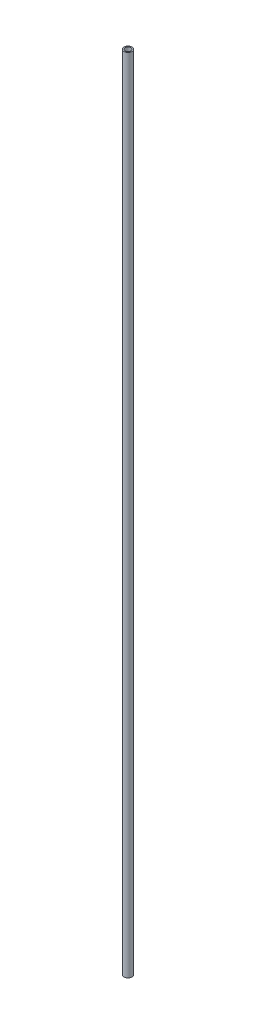
ISO-10303-21;
HEADER;
FILE_DESCRIPTION(('STEP AP214'),'2;1');
FILE_NAME('part.step','',(''),(''),'','','');
FILE_SCHEMA(('AUTOMOTIVE_DESIGN { 1 0 10303 214 1 1 1 1 }'));
ENDSEC;
DATA;
#1=APPLICATION_CONTEXT('core data for automotive mechanical design processes');
#2=APPLICATION_PROTOCOL_DEFINITION('international standard','automotive_design',2000,#1);
#3=PRODUCT_CONTEXT('',#1,'mechanical');
#4=PRODUCT('Part','Part','',(#3));
#5=PRODUCT_RELATED_PRODUCT_CATEGORY('part','',(#4));
#6=PRODUCT_DEFINITION_FORMATION('','',#4);
#7=PRODUCT_DEFINITION_CONTEXT('part definition',#1,'design');
#8=PRODUCT_DEFINITION('design','',#6,#7);
#9=PRODUCT_DEFINITION_SHAPE('','',#8);
#10=(LENGTH_UNIT() NAMED_UNIT(*) SI_UNIT(.MILLI.,.METRE.));
#11=(NAMED_UNIT(*) PLANE_ANGLE_UNIT() SI_UNIT($,.RADIAN.));
#12=(NAMED_UNIT(*) SI_UNIT($,.STERADIAN.) SOLID_ANGLE_UNIT());
#13=UNCERTAINTY_MEASURE_WITH_UNIT(LENGTH_MEASURE(1.E-05),#10,'distance_accuracy_value','');
#14=(GEOMETRIC_REPRESENTATION_CONTEXT(3) GLOBAL_UNCERTAINTY_ASSIGNED_CONTEXT((#13)) GLOBAL_UNIT_ASSIGNED_CONTEXT((#10,
#11,#12)) REPRESENTATION_CONTEXT('',''));
#15=CARTESIAN_POINT('',(0.,0.,0.));
#16=DIRECTION('',(0.,0.,1.));
#17=DIRECTION('',(1.,0.,0.));
#18=AXIS2_PLACEMENT_3D('',#15,#16,#17);
#19=CARTESIAN_POINT('',(0.,1930.,0.));
#20=DIRECTION('',(0.,1.,0.));
#21=DIRECTION('',(0.,0.,1.));
#22=AXIS2_PLACEMENT_3D('',#19,#20,#21);
#23=PLANE('',#22);
#24=CARTESIAN_POINT('',(0.,1930.,0.));
#25=DIRECTION('',(0.,1.,0.));
#26=DIRECTION('',(0.,0.,1.));
#27=AXIS2_PLACEMENT_3D('',#24,#25,#26);
#28=CIRCLE('',#27,9.5);
#29=CARTESIAN_POINT('',(0.,1930.,9.5));
#30=VERTEX_POINT('',#29);
#31=EDGE_CURVE('E10',#30,#30,#28,.T.);
#32=ORIENTED_EDGE('',*,*,#31,.T.);
#33=EDGE_LOOP('',(#32));
#34=FACE_BOUND('',#33,.T.);
#35=CARTESIAN_POINT('',(0.,1930.,0.));
#36=DIRECTION('',(0.,1.,0.));
#37=DIRECTION('',(0.,0.,1.));
#38=AXIS2_PLACEMENT_3D('',#35,#36,#37);
#39=CIRCLE('',#38,6.9);
#40=CARTESIAN_POINT('',(0.,1930.,6.9));
#41=VERTEX_POINT('',#40);
#42=EDGE_CURVE('E42',#41,#41,#39,.T.);
#43=ORIENTED_EDGE('',*,*,#42,.F.);
#44=EDGE_LOOP('',(#43));
#45=FACE_BOUND('',#44,.T.);
#46=ADVANCED_FACE('F31',(#34,#45),#23,.T.);
#47=CARTESIAN_POINT('',(0.,0.,0.));
#48=DIRECTION('',(0.,1.,0.));
#49=DIRECTION('',(0.,0.,1.));
#50=AXIS2_PLACEMENT_3D('',#47,#48,#49);
#51=PLANE('',#50);
#52=CARTESIAN_POINT('',(0.,0.,0.));
#53=DIRECTION('',(0.,1.,0.));
#54=DIRECTION('',(0.,0.,1.));
#55=AXIS2_PLACEMENT_3D('',#52,#53,#54);
#56=CIRCLE('',#55,9.5);
#57=CARTESIAN_POINT('',(0.,0.,9.5));
#58=VERTEX_POINT('',#57);
#59=EDGE_CURVE('E35',#58,#58,#56,.T.);
#60=ORIENTED_EDGE('',*,*,#59,.F.);
#61=EDGE_LOOP('',(#60));
#62=FACE_BOUND('',#61,.T.);
#63=CARTESIAN_POINT('',(0.,0.,0.));
#64=DIRECTION('',(0.,1.,0.));
#65=DIRECTION('',(0.,0.,1.));
#66=AXIS2_PLACEMENT_3D('',#63,#64,#65);
#67=CIRCLE('',#66,6.9);
#68=CARTESIAN_POINT('',(0.,0.,6.9));
#69=VERTEX_POINT('',#68);
#70=EDGE_CURVE('E44',#69,#69,#67,.T.);
#71=ORIENTED_EDGE('',*,*,#70,.T.);
#72=EDGE_LOOP('',(#71));
#73=FACE_BOUND('',#72,.T.);
#74=ADVANCED_FACE('F54',(#62,#73),#51,.F.);
#75=CARTESIAN_POINT('',(0.,1930.,0.));
#76=DIRECTION('',(0.,-1.,0.));
#77=DIRECTION('',(0.,0.,-1.));
#78=AXIS2_PLACEMENT_3D('',#75,#76,#77);
#79=CYLINDRICAL_SURFACE('',#78,9.5);
#80=ORIENTED_EDGE('',*,*,#31,.F.);
#81=EDGE_LOOP('',(#80));
#82=FACE_BOUND('',#81,.T.);
#83=ORIENTED_EDGE('',*,*,#59,.T.);
#84=EDGE_LOOP('',(#83));
#85=FACE_BOUND('',#84,.T.);
#86=ADVANCED_FACE('F33',(#82,#85),#79,.T.);
#87=CARTESIAN_POINT('',(0.,1930.,0.));
#88=DIRECTION('',(0.,-1.,0.));
#89=DIRECTION('',(0.,0.,-1.));
#90=AXIS2_PLACEMENT_3D('',#87,#88,#89);
#91=CYLINDRICAL_SURFACE('',#90,6.9);
#92=ORIENTED_EDGE('',*,*,#42,.T.);
#93=EDGE_LOOP('',(#92));
#94=FACE_BOUND('',#93,.T.);
#95=ORIENTED_EDGE('',*,*,#70,.F.);
#96=EDGE_LOOP('',(#95));
#97=FACE_BOUND('',#96,.T.);
#98=ADVANCED_FACE('F50',(#94,#97),#91,.F.);
#99=CLOSED_SHELL('',(#46,#74,#86,#98));
#100=MANIFOLD_SOLID_BREP('B2',#99);
#101=ADVANCED_BREP_SHAPE_REPRESENTATION('',(#18,#100),#14);
#102=SHAPE_DEFINITION_REPRESENTATION(#9,#101);
ENDSEC;
END-ISO-10303-21;
